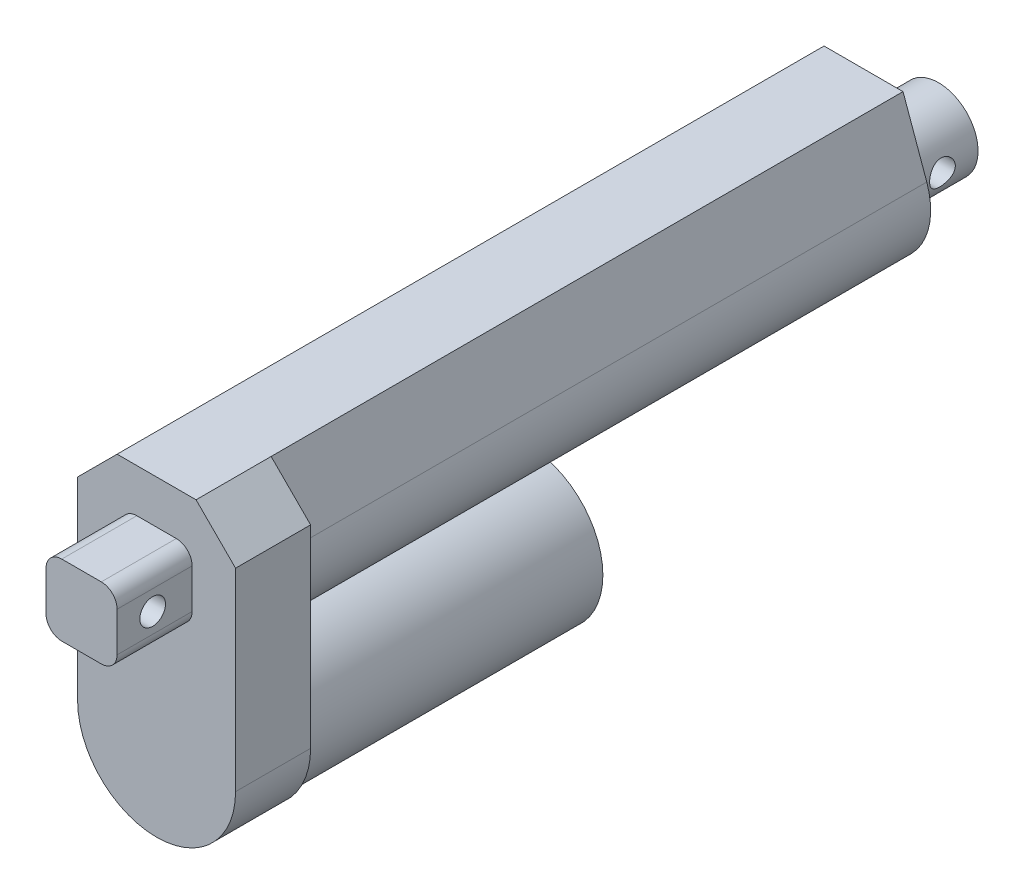
ISO-10303-21;
HEADER;
FILE_DESCRIPTION(('STEP AP214'),'2;1');
FILE_NAME('part.step','',(''),(''),'','','');
FILE_SCHEMA(('AUTOMOTIVE_DESIGN { 1 0 10303 214 1 1 1 1 }'));
ENDSEC;
DATA;
#1=APPLICATION_CONTEXT('core data for automotive mechanical design processes');
#2=APPLICATION_PROTOCOL_DEFINITION('international standard','automotive_design',2000,#1);
#3=PRODUCT_CONTEXT('',#1,'mechanical');
#4=PRODUCT('Part','Part','',(#3));
#5=PRODUCT_RELATED_PRODUCT_CATEGORY('part','',(#4));
#6=PRODUCT_DEFINITION_FORMATION('','',#4);
#7=PRODUCT_DEFINITION_CONTEXT('part definition',#1,'design');
#8=PRODUCT_DEFINITION('design','',#6,#7);
#9=PRODUCT_DEFINITION_SHAPE('','',#8);
#10=(LENGTH_UNIT() NAMED_UNIT(*) SI_UNIT(.MILLI.,.METRE.));
#11=(NAMED_UNIT(*) PLANE_ANGLE_UNIT() SI_UNIT($,.RADIAN.));
#12=(NAMED_UNIT(*) SI_UNIT($,.STERADIAN.) SOLID_ANGLE_UNIT());
#13=UNCERTAINTY_MEASURE_WITH_UNIT(LENGTH_MEASURE(1.E-05),#10,'distance_accuracy_value','');
#14=(GEOMETRIC_REPRESENTATION_CONTEXT(3) GLOBAL_UNCERTAINTY_ASSIGNED_CONTEXT((#13)) GLOBAL_UNIT_ASSIGNED_CONTEXT((#10,
#11,#12)) REPRESENTATION_CONTEXT('',''));
#15=CARTESIAN_POINT('',(0.,0.,0.));
#16=DIRECTION('',(0.,0.,1.));
#17=DIRECTION('',(1.,0.,0.));
#18=AXIS2_PLACEMENT_3D('',#15,#16,#17);
#19=CARTESIAN_POINT('',(0.,0.,0.));
#20=DIRECTION('',(0.,0.,1.));
#21=DIRECTION('',(1.,0.,0.));
#22=AXIS2_PLACEMENT_3D('',#19,#20,#21);
#23=PLANE('',#22);
#24=DIRECTION('',(0.,1.,0.));
#25=VECTOR('',#24,1.);
#26=CARTESIAN_POINT('',(-20.,0.,0.));
#27=LINE('',#26,#25);
#28=CARTESIAN_POINT('',(-20.,0.,0.));
#29=VERTEX_POINT('',#28);
#30=CARTESIAN_POINT('',(-20.,49.,0.));
#31=VERTEX_POINT('',#30);
#32=EDGE_CURVE('E185',#29,#31,#27,.T.);
#33=ORIENTED_EDGE('',*,*,#32,.F.);
#34=CARTESIAN_POINT('',(0.,0.,0.));
#35=DIRECTION('',(0.,0.,1.));
#36=DIRECTION('',(1.,0.,0.));
#37=AXIS2_PLACEMENT_3D('',#34,#35,#36);
#38=CIRCLE('',#37,20.);
#39=CARTESIAN_POINT('',(20.,0.,0.));
#40=VERTEX_POINT('',#39);
#41=EDGE_CURVE('E188',#29,#40,#38,.T.);
#42=ORIENTED_EDGE('',*,*,#41,.T.);
#43=DIRECTION('',(0.,-1.,0.));
#44=VECTOR('',#43,1.);
#45=CARTESIAN_POINT('',(20.,0.,0.));
#46=LINE('',#45,#44);
#47=CARTESIAN_POINT('',(20.,49.,0.));
#48=VERTEX_POINT('',#47);
#49=EDGE_CURVE('E210',#48,#40,#46,.T.);
#50=ORIENTED_EDGE('',*,*,#49,.F.);
#51=DIRECTION('',(0.707106781186548,-0.707106781186547,0.));
#52=VECTOR('',#51,1.);
#53=CARTESIAN_POINT('',(34.5,34.5,0.));
#54=LINE('',#53,#52);
#55=CARTESIAN_POINT('',(10.,59.,0.));
#56=VERTEX_POINT('',#55);
#57=EDGE_CURVE('E213',#56,#48,#54,.T.);
#58=ORIENTED_EDGE('',*,*,#57,.F.);
#59=DIRECTION('',(1.,0.,0.));
#60=VECTOR('',#59,1.);
#61=CARTESIAN_POINT('',(0.,59.,0.));
#62=LINE('',#61,#60);
#63=CARTESIAN_POINT('',(-10.,59.,0.));
#64=VERTEX_POINT('',#63);
#65=EDGE_CURVE('E215',#64,#56,#62,.T.);
#66=ORIENTED_EDGE('',*,*,#65,.F.);
#67=DIRECTION('',(0.707106781186548,0.707106781186547,0.));
#68=VECTOR('',#67,1.);
#69=CARTESIAN_POINT('',(-34.5,34.5,0.));
#70=LINE('',#69,#68);
#71=EDGE_CURVE('E198',#31,#64,#70,.T.);
#72=ORIENTED_EDGE('',*,*,#71,.F.);
#73=EDGE_LOOP('',(#33,#42,#50,#58,#66,#72));
#74=FACE_BOUND('',#73,.T.);
#75=DIRECTION('',(-1.,0.,0.));
#76=VECTOR('',#75,1.);
#77=CARTESIAN_POINT('',(-9.,48.,0.));
#78=LINE('',#77,#76);
#79=CARTESIAN_POINT('',(5.,48.,0.));
#80=VERTEX_POINT('',#79);
#81=CARTESIAN_POINT('',(-5.,48.,0.));
#82=VERTEX_POINT('',#81);
#83=EDGE_CURVE('E386',#80,#82,#78,.T.);
#84=ORIENTED_EDGE('',*,*,#83,.F.);
#85=CARTESIAN_POINT('',(5.,44.,0.));
#86=DIRECTION('',(0.,0.,1.));
#87=DIRECTION('',(1.,0.,0.));
#88=AXIS2_PLACEMENT_3D('',#85,#86,#87);
#89=CIRCLE('',#88,4.);
#90=CARTESIAN_POINT('',(9.00000000000001,44.,0.));
#91=VERTEX_POINT('',#90);
#92=EDGE_CURVE('E11',#80,#91,#89,.F.);
#93=ORIENTED_EDGE('',*,*,#92,.T.);
#94=DIRECTION('',(0.,1.,0.));
#95=VECTOR('',#94,1.);
#96=CARTESIAN_POINT('',(9.00000000000001,48.,0.));
#97=LINE('',#96,#95);
#98=CARTESIAN_POINT('',(9.00000000000001,34.,0.));
#99=VERTEX_POINT('',#98);
#100=EDGE_CURVE('E357',#99,#91,#97,.T.);
#101=ORIENTED_EDGE('',*,*,#100,.F.);
#102=CARTESIAN_POINT('',(5.,34.,0.));
#103=DIRECTION('',(0.,0.,1.));
#104=DIRECTION('',(1.,0.,0.));
#105=AXIS2_PLACEMENT_3D('',#102,#103,#104);
#106=CIRCLE('',#105,4.);
#107=CARTESIAN_POINT('',(5.,30.,0.));
#108=VERTEX_POINT('',#107);
#109=EDGE_CURVE('E351',#99,#108,#106,.F.);
#110=ORIENTED_EDGE('',*,*,#109,.T.);
#111=DIRECTION('',(1.,0.,0.));
#112=VECTOR('',#111,1.);
#113=CARTESIAN_POINT('',(-8.99999999999999,30.,0.));
#114=LINE('',#113,#112);
#115=CARTESIAN_POINT('',(-4.99999999999999,30.,0.));
#116=VERTEX_POINT('',#115);
#117=EDGE_CURVE('E355',#116,#108,#114,.T.);
#118=ORIENTED_EDGE('',*,*,#117,.F.);
#119=CARTESIAN_POINT('',(-4.99999999999999,34.,0.));
#120=DIRECTION('',(0.,0.,1.));
#121=DIRECTION('',(1.,0.,0.));
#122=AXIS2_PLACEMENT_3D('',#119,#120,#121);
#123=CIRCLE('',#122,4.);
#124=CARTESIAN_POINT('',(-8.99999999999999,34.,0.));
#125=VERTEX_POINT('',#124);
#126=EDGE_CURVE('E349',#116,#125,#123,.F.);
#127=ORIENTED_EDGE('',*,*,#126,.T.);
#128=DIRECTION('',(0.,-1.,0.));
#129=VECTOR('',#128,1.);
#130=CARTESIAN_POINT('',(-9.,48.,0.));
#131=LINE('',#130,#129);
#132=CARTESIAN_POINT('',(-9.,44.,0.));
#133=VERTEX_POINT('',#132);
#134=EDGE_CURVE('E369',#133,#125,#131,.T.);
#135=ORIENTED_EDGE('',*,*,#134,.F.);
#136=CARTESIAN_POINT('',(-5.,44.,0.));
#137=DIRECTION('',(0.,0.,1.));
#138=DIRECTION('',(1.,0.,0.));
#139=AXIS2_PLACEMENT_3D('',#136,#137,#138);
#140=CIRCLE('',#139,4.);
#141=EDGE_CURVE('E49',#133,#82,#140,.F.);
#142=ORIENTED_EDGE('',*,*,#141,.T.);
#143=EDGE_LOOP('',(#84,#93,#101,#110,#118,#127,#135,#142));
#144=FACE_BOUND('',#143,.T.);
#145=ADVANCED_FACE('F41',(#74,#144),#23,.T.);
#146=CARTESIAN_POINT('',(-20.,0.,-19.));
#147=DIRECTION('',(1.,0.,0.));
#148=DIRECTION('',(0.,0.,-1.));
#149=AXIS2_PLACEMENT_3D('',#146,#147,#148);
#150=PLANE('',#149);
#151=ORIENTED_EDGE('',*,*,#32,.T.);
#152=DIRECTION('',(0.,0.,1.));
#153=VECTOR('',#152,1.);
#154=CARTESIAN_POINT('',(-20.,49.,-19.));
#155=LINE('',#154,#153);
#156=CARTESIAN_POINT('',(-20.,49.,-19.));
#157=VERTEX_POINT('',#156);
#158=EDGE_CURVE('E218',#157,#31,#155,.T.);
#159=ORIENTED_EDGE('',*,*,#158,.F.);
#160=DIRECTION('',(0.,1.,0.));
#161=VECTOR('',#160,1.);
#162=CARTESIAN_POINT('',(-20.,0.,-19.));
#163=LINE('',#162,#161);
#164=CARTESIAN_POINT('',(-20.,0.,-19.));
#165=VERTEX_POINT('',#164);
#166=EDGE_CURVE('E194',#165,#157,#163,.T.);
#167=ORIENTED_EDGE('',*,*,#166,.F.);
#168=DIRECTION('',(0.,0.,1.));
#169=VECTOR('',#168,1.);
#170=CARTESIAN_POINT('',(-20.,0.,-19.));
#171=LINE('',#170,#169);
#172=EDGE_CURVE('E206',#165,#29,#171,.T.);
#173=ORIENTED_EDGE('',*,*,#172,.T.);
#174=EDGE_LOOP('',(#151,#159,#167,#173));
#175=FACE_BOUND('',#174,.T.);
#176=ADVANCED_FACE('F270',(#175),#150,.F.);
#177=CARTESIAN_POINT('',(-34.5,34.5,-19.));
#178=DIRECTION('',(0.707106781186547,-0.707106781186548,0.));
#179=DIRECTION('',(0.707106781186548,0.707106781186547,0.));
#180=AXIS2_PLACEMENT_3D('',#177,#178,#179);
#181=PLANE('',#180);
#182=ORIENTED_EDGE('',*,*,#71,.T.);
#183=DIRECTION('',(0.,0.,1.));
#184=VECTOR('',#183,1.);
#185=CARTESIAN_POINT('',(-10.,59.,-19.));
#186=LINE('',#185,#184);
#187=CARTESIAN_POINT('',(-10.,59.,-19.));
#188=VERTEX_POINT('',#187);
#189=EDGE_CURVE('E222',#188,#64,#186,.T.);
#190=ORIENTED_EDGE('',*,*,#189,.F.);
#191=DIRECTION('',(0.707106781186548,0.707106781186547,0.));
#192=VECTOR('',#191,1.);
#193=CARTESIAN_POINT('',(-34.5,34.5,-19.));
#194=LINE('',#193,#192);
#195=EDGE_CURVE('E205',#157,#188,#194,.T.);
#196=ORIENTED_EDGE('',*,*,#195,.F.);
#197=ORIENTED_EDGE('',*,*,#158,.T.);
#198=EDGE_LOOP('',(#182,#190,#196,#197));
#199=FACE_BOUND('',#198,.T.);
#200=ADVANCED_FACE('F278',(#199),#181,.F.);
#201=CARTESIAN_POINT('',(0.,59.,-19.));
#202=DIRECTION('',(0.,-1.,0.));
#203=DIRECTION('',(0.,0.,-1.));
#204=AXIS2_PLACEMENT_3D('',#201,#202,#203);
#205=PLANE('',#204);
#206=ORIENTED_EDGE('',*,*,#65,.T.);
#207=DIRECTION('',(0.,0.,1.));
#208=VECTOR('',#207,1.);
#209=CARTESIAN_POINT('',(10.,59.,-19.));
#210=LINE('',#209,#208);
#211=CARTESIAN_POINT('',(10.,59.,-19.));
#212=VERTEX_POINT('',#211);
#213=EDGE_CURVE('E225',#212,#56,#210,.T.);
#214=ORIENTED_EDGE('',*,*,#213,.F.);
#215=DIRECTION('',(0.,0.,1.));
#216=VECTOR('',#215,1.);
#217=CARTESIAN_POINT('',(9.99999999999999,59.,-179.));
#218=LINE('',#217,#216);
#219=CARTESIAN_POINT('',(9.99999999999999,59.,-179.));
#220=VERTEX_POINT('',#219);
#221=EDGE_CURVE('E399',#220,#212,#218,.T.);
#222=ORIENTED_EDGE('',*,*,#221,.F.);
#223=DIRECTION('',(1.,0.,0.));
#224=VECTOR('',#223,1.);
#225=CARTESIAN_POINT('',(0.,59.,-179.));
#226=LINE('',#225,#224);
#227=CARTESIAN_POINT('',(-10.,59.,-179.));
#228=VERTEX_POINT('',#227);
#229=EDGE_CURVE('E177',#228,#220,#226,.T.);
#230=ORIENTED_EDGE('',*,*,#229,.F.);
#231=DIRECTION('',(0.,0.,1.));
#232=VECTOR('',#231,1.);
#233=CARTESIAN_POINT('',(-10.,59.,-179.));
#234=LINE('',#233,#232);
#235=EDGE_CURVE('E190',#228,#188,#234,.T.);
#236=ORIENTED_EDGE('',*,*,#235,.T.);
#237=ORIENTED_EDGE('',*,*,#189,.T.);
#238=EDGE_LOOP('',(#206,#214,#222,#230,#236,#237));
#239=FACE_BOUND('',#238,.T.);
#240=ADVANCED_FACE('F288',(#239),#205,.F.);
#241=CARTESIAN_POINT('',(34.5,34.5,-19.));
#242=DIRECTION('',(-0.707106781186547,-0.707106781186548,0.));
#243=DIRECTION('',(0.707106781186548,-0.707106781186547,0.));
#244=AXIS2_PLACEMENT_3D('',#241,#242,#243);
#245=PLANE('',#244);
#246=ORIENTED_EDGE('',*,*,#57,.T.);
#247=DIRECTION('',(0.,0.,1.));
#248=VECTOR('',#247,1.);
#249=CARTESIAN_POINT('',(20.,49.,-19.));
#250=LINE('',#249,#248);
#251=CARTESIAN_POINT('',(20.,49.,-19.));
#252=VERTEX_POINT('',#251);
#253=EDGE_CURVE('E228',#252,#48,#250,.T.);
#254=ORIENTED_EDGE('',*,*,#253,.F.);
#255=DIRECTION('',(0.707106781186548,-0.707106781186547,0.));
#256=VECTOR('',#255,1.);
#257=CARTESIAN_POINT('',(34.5,34.5,-19.));
#258=LINE('',#257,#256);
#259=EDGE_CURVE('E203',#212,#252,#258,.T.);
#260=ORIENTED_EDGE('',*,*,#259,.F.);
#261=ORIENTED_EDGE('',*,*,#213,.T.);
#262=EDGE_LOOP('',(#246,#254,#260,#261));
#263=FACE_BOUND('',#262,.T.);
#264=ADVANCED_FACE('F292',(#263),#245,.F.);
#265=CARTESIAN_POINT('',(20.,0.,-19.));
#266=DIRECTION('',(-1.,0.,0.));
#267=DIRECTION('',(0.,0.,1.));
#268=AXIS2_PLACEMENT_3D('',#265,#266,#267);
#269=PLANE('',#268);
#270=ORIENTED_EDGE('',*,*,#49,.T.);
#271=DIRECTION('',(0.,0.,1.));
#272=VECTOR('',#271,1.);
#273=CARTESIAN_POINT('',(20.,0.,-19.));
#274=LINE('',#273,#272);
#275=CARTESIAN_POINT('',(20.,0.,-19.));
#276=VERTEX_POINT('',#275);
#277=EDGE_CURVE('E231',#276,#40,#274,.T.);
#278=ORIENTED_EDGE('',*,*,#277,.F.);
#279=DIRECTION('',(0.,-1.,0.));
#280=VECTOR('',#279,1.);
#281=CARTESIAN_POINT('',(20.,0.,-19.));
#282=LINE('',#281,#280);
#283=EDGE_CURVE('E201',#252,#276,#282,.T.);
#284=ORIENTED_EDGE('',*,*,#283,.F.);
#285=ORIENTED_EDGE('',*,*,#253,.T.);
#286=EDGE_LOOP('',(#270,#278,#284,#285));
#287=FACE_BOUND('',#286,.T.);
#288=ADVANCED_FACE('F296',(#287),#269,.F.);
#289=CARTESIAN_POINT('',(0.,0.,-19.));
#290=DIRECTION('',(0.,0.,1.));
#291=DIRECTION('',(1.,0.,0.));
#292=AXIS2_PLACEMENT_3D('',#289,#290,#291);
#293=CYLINDRICAL_SURFACE('',#292,20.);
#294=ORIENTED_EDGE('',*,*,#41,.F.);
#295=ORIENTED_EDGE('',*,*,#172,.F.);
#296=CARTESIAN_POINT('',(0.,0.,-19.));
#297=DIRECTION('',(0.,0.,1.));
#298=DIRECTION('',(1.,0.,0.));
#299=AXIS2_PLACEMENT_3D('',#296,#297,#298);
#300=CIRCLE('',#299,20.);
#301=EDGE_CURVE('E197',#165,#276,#300,.T.);
#302=ORIENTED_EDGE('',*,*,#301,.T.);
#303=ORIENTED_EDGE('',*,*,#277,.T.);
#304=EDGE_LOOP('',(#294,#295,#302,#303));
#305=FACE_BOUND('',#304,.T.);
#306=ADVANCED_FACE('F300',(#305),#293,.T.);
#307=CARTESIAN_POINT('',(0.,0.,-19.));
#308=DIRECTION('',(0.,0.,1.));
#309=DIRECTION('',(1.,0.,0.));
#310=AXIS2_PLACEMENT_3D('',#307,#308,#309);
#311=PLANE('',#310);
#312=CARTESIAN_POINT('',(0.,0.,-19.));
#313=DIRECTION('',(0.,0.,1.));
#314=DIRECTION('',(1.,0.,0.));
#315=AXIS2_PLACEMENT_3D('',#312,#313,#314);
#316=CIRCLE('',#315,19.);
#317=CARTESIAN_POINT('',(19.,0.,-19.));
#318=VERTEX_POINT('',#317);
#319=EDGE_CURVE('E372',#318,#318,#316,.F.);
#320=ORIENTED_EDGE('',*,*,#319,.F.);
#321=EDGE_LOOP('',(#320));
#322=FACE_BOUND('',#321,.T.);
#323=DIRECTION('',(0.336418561126064,-0.941712563221851,0.));
#324=VECTOR('',#323,1.);
#325=CARTESIAN_POINT('',(27.5599910625912,9.84556530307208,-19.));
#326=LINE('',#325,#324);
#327=CARTESIAN_POINT('',(16.0091135747715,42.1791155391431,-19.));
#328=VERTEX_POINT('',#327);
#329=EDGE_CURVE('E184',#212,#328,#326,.T.);
#330=ORIENTED_EDGE('',*,*,#329,.F.);
#331=ORIENTED_EDGE('',*,*,#259,.T.);
#332=ORIENTED_EDGE('',*,*,#283,.T.);
#333=ORIENTED_EDGE('',*,*,#301,.F.);
#334=ORIENTED_EDGE('',*,*,#166,.T.);
#335=ORIENTED_EDGE('',*,*,#195,.T.);
#336=DIRECTION('',(-0.336418561126065,-0.941712563221851,0.));
#337=VECTOR('',#336,1.);
#338=CARTESIAN_POINT('',(-27.5599910625912,9.8455653030721,-19.));
#339=LINE('',#338,#337);
#340=CARTESIAN_POINT('',(-16.0091135747715,42.1791155391431,-19.));
#341=VERTEX_POINT('',#340);
#342=EDGE_CURVE('E181',#188,#341,#339,.T.);
#343=ORIENTED_EDGE('',*,*,#342,.T.);
#344=CARTESIAN_POINT('',(0.,36.46,-19.));
#345=DIRECTION('',(0.,0.,-1.));
#346=DIRECTION('',(-1.,0.,0.));
#347=AXIS2_PLACEMENT_3D('',#344,#345,#346);
#348=CIRCLE('',#347,17.);
#349=EDGE_CURVE('E401',#328,#341,#348,.T.);
#350=ORIENTED_EDGE('',*,*,#349,.F.);
#351=EDGE_LOOP('',(#330,#331,#332,#333,#334,#335,#343,#350));
#352=FACE_BOUND('',#351,.T.);
#353=ADVANCED_FACE('F284',(#322,#352),#311,.F.);
#354=CARTESIAN_POINT('',(27.5599910625912,9.84556530307208,-179.));
#355=DIRECTION('',(-0.941712563221851,-0.336418561126064,0.));
#356=DIRECTION('',(0.336418561126064,-0.941712563221851,0.));
#357=AXIS2_PLACEMENT_3D('',#354,#355,#356);
#358=PLANE('',#357);
#359=ORIENTED_EDGE('',*,*,#329,.T.);
#360=DIRECTION('',(0.,0.,1.));
#361=VECTOR('',#360,1.);
#362=CARTESIAN_POINT('',(16.0091135747715,42.1791155391431,-179.));
#363=LINE('',#362,#361);
#364=CARTESIAN_POINT('',(16.0091135747715,42.1791155391431,-179.));
#365=VERTEX_POINT('',#364);
#366=EDGE_CURVE('E164',#365,#328,#363,.T.);
#367=ORIENTED_EDGE('',*,*,#366,.F.);
#368=DIRECTION('',(0.336418561126064,-0.941712563221851,0.));
#369=VECTOR('',#368,1.);
#370=CARTESIAN_POINT('',(27.5599910625912,9.84556530307208,-179.));
#371=LINE('',#370,#369);
#372=EDGE_CURVE('E172',#220,#365,#371,.T.);
#373=ORIENTED_EDGE('',*,*,#372,.F.);
#374=ORIENTED_EDGE('',*,*,#221,.T.);
#375=EDGE_LOOP('',(#359,#367,#373,#374));
#376=FACE_BOUND('',#375,.T.);
#377=ADVANCED_FACE('F183',(#376),#358,.F.);
#378=CARTESIAN_POINT('',(0.,36.46,-179.));
#379=DIRECTION('',(0.,0.,1.));
#380=DIRECTION('',(1.,0.,0.));
#381=AXIS2_PLACEMENT_3D('',#378,#379,#380);
#382=CYLINDRICAL_SURFACE('',#381,17.);
#383=ORIENTED_EDGE('',*,*,#349,.T.);
#384=DIRECTION('',(0.,0.,1.));
#385=VECTOR('',#384,1.);
#386=CARTESIAN_POINT('',(-16.0091135747715,42.1791155391431,-179.));
#387=LINE('',#386,#385);
#388=CARTESIAN_POINT('',(-16.0091135747715,42.1791155391431,-179.));
#389=VERTEX_POINT('',#388);
#390=EDGE_CURVE('E167',#389,#341,#387,.T.);
#391=ORIENTED_EDGE('',*,*,#390,.F.);
#392=CARTESIAN_POINT('',(0.,36.46,-179.));
#393=DIRECTION('',(0.,0.,-1.));
#394=DIRECTION('',(-1.,0.,0.));
#395=AXIS2_PLACEMENT_3D('',#392,#393,#394);
#396=CIRCLE('',#395,17.);
#397=EDGE_CURVE('E159',#365,#389,#396,.T.);
#398=ORIENTED_EDGE('',*,*,#397,.F.);
#399=ORIENTED_EDGE('',*,*,#366,.T.);
#400=EDGE_LOOP('',(#383,#391,#398,#399));
#401=FACE_BOUND('',#400,.T.);
#402=ADVANCED_FACE('F162',(#401),#382,.T.);
#403=CARTESIAN_POINT('',(-27.5599910625912,9.8455653030721,-179.));
#404=DIRECTION('',(-0.941712563221851,0.336418561126065,0.));
#405=DIRECTION('',(-0.336418561126065,-0.941712563221851,0.));
#406=AXIS2_PLACEMENT_3D('',#403,#404,#405);
#407=PLANE('',#406);
#408=ORIENTED_EDGE('',*,*,#342,.F.);
#409=ORIENTED_EDGE('',*,*,#235,.F.);
#410=DIRECTION('',(-0.336418561126065,-0.941712563221851,0.));
#411=VECTOR('',#410,1.);
#412=CARTESIAN_POINT('',(-27.5599910625912,9.8455653030721,-179.));
#413=LINE('',#412,#411);
#414=EDGE_CURVE('E171',#228,#389,#413,.T.);
#415=ORIENTED_EDGE('',*,*,#414,.T.);
#416=ORIENTED_EDGE('',*,*,#390,.T.);
#417=EDGE_LOOP('',(#408,#409,#415,#416));
#418=FACE_BOUND('',#417,.T.);
#419=ADVANCED_FACE('F409',(#418),#407,.T.);
#420=CARTESIAN_POINT('',(0.,0.,-179.));
#421=DIRECTION('',(0.,0.,-1.));
#422=DIRECTION('',(-1.,0.,0.));
#423=AXIS2_PLACEMENT_3D('',#420,#421,#422);
#424=PLANE('',#423);
#425=CARTESIAN_POINT('',(0.,36.46,-179.));
#426=DIRECTION('',(0.,0.,-1.));
#427=DIRECTION('',(-1.,0.,0.));
#428=AXIS2_PLACEMENT_3D('',#425,#426,#427);
#429=CIRCLE('',#428,10.);
#430=CARTESIAN_POINT('',(-10.,36.46,-179.));
#431=VERTEX_POINT('',#430);
#432=EDGE_CURVE('E221',#431,#431,#429,.T.);
#433=ORIENTED_EDGE('',*,*,#432,.F.);
#434=EDGE_LOOP('',(#433));
#435=FACE_BOUND('',#434,.T.);
#436=ORIENTED_EDGE('',*,*,#372,.T.);
#437=ORIENTED_EDGE('',*,*,#397,.T.);
#438=ORIENTED_EDGE('',*,*,#414,.F.);
#439=ORIENTED_EDGE('',*,*,#229,.T.);
#440=EDGE_LOOP('',(#436,#437,#438,#439));
#441=FACE_BOUND('',#440,.T.);
#442=ADVANCED_FACE('F175',(#435,#441),#424,.T.);
#443=CARTESIAN_POINT('',(0.,36.46,-198.));
#444=DIRECTION('',(0.,0.,1.));
#445=DIRECTION('',(1.,0.,0.));
#446=AXIS2_PLACEMENT_3D('',#443,#444,#445);
#447=CYLINDRICAL_SURFACE('',#446,10.);
#448=CARTESIAN_POINT('',(10.,36.46,-192.21728146111));
#449=CARTESIAN_POINT('',(9.99999986147675,36.2852267054536,-192.242270545886));
#450=CARTESIAN_POINT('',(9.99537581916662,36.1084109669922,-192.252971967629));
#451=CARTESIAN_POINT('',(9.97674188954075,35.7558834728552,-192.245611262686));
#452=CARTESIAN_POINT('',(9.96273174762877,35.5801717472563,-192.227548355754));
#453=CARTESIAN_POINT('',(9.92621231513767,35.2350945253202,-192.163570953362));
#454=CARTESIAN_POINT('',(9.90371456679146,35.0657207523412,-192.117694230503));
#455=CARTESIAN_POINT('',(9.85192595807166,34.7374431165955,-191.999814332676));
#456=CARTESIAN_POINT('',(9.82263380146499,34.5785412590919,-191.927806170887));
#457=CARTESIAN_POINT('',(9.75871385456787,34.2707286685426,-191.757519086339));
#458=CARTESIAN_POINT('',(9.72396078388169,34.1222164055505,-191.65856796115));
#459=CARTESIAN_POINT('',(9.65271466729046,33.8435481861153,-191.43799408411));
#460=CARTESIAN_POINT('',(9.61622108685189,33.7133979180921,-191.31636433355));
#461=CARTESIAN_POINT('',(9.54314731276294,33.4691256995524,-191.047347785952));
#462=CARTESIAN_POINT('',(9.50663613349773,33.3559799927062,-190.899052823597));
#463=CARTESIAN_POINT('',(9.43908761594782,33.1562472583259,-190.584386605831));
#464=CARTESIAN_POINT('',(9.40804975812996,33.0696577094774,-190.4180170685));
#465=CARTESIAN_POINT('',(9.35549219422971,32.9272292812594,-190.074500679166));
#466=CARTESIAN_POINT('',(9.33382054895043,32.8708956200305,-189.897583378256));
#467=CARTESIAN_POINT('',(9.30196637665703,32.789115013157,-189.535781501334));
#468=CARTESIAN_POINT('',(9.29177728658934,32.7636504231288,-189.350901539324));
#469=CARTESIAN_POINT('',(9.28447717009103,32.7453595188411,-188.991432998118));
#470=CARTESIAN_POINT('',(9.28655529822521,32.7505097721879,-188.816961084536));
#471=CARTESIAN_POINT('',(9.30165739473878,32.7885452421265,-188.471568682629));
#472=CARTESIAN_POINT('',(9.31468098017105,32.8214294883932,-188.300648070269));
#473=CARTESIAN_POINT('',(9.34985530947712,32.9128146605513,-187.970100056181));
#474=CARTESIAN_POINT('',(9.3718424879765,32.9708576381873,-187.810327449976));
#475=CARTESIAN_POINT('',(9.42266507895349,33.1105397766892,-187.502640088642));
#476=CARTESIAN_POINT('',(9.45150221343077,33.192184871976,-187.35472832772));
#477=CARTESIAN_POINT('',(9.51506006509683,33.3819864578544,-187.066099965429));
#478=CARTESIAN_POINT('',(9.55001846673214,33.4913626562013,-186.926238047068));
#479=CARTESIAN_POINT('',(9.6212876669345,33.7311799179576,-186.666279615373));
#480=CARTESIAN_POINT('',(9.65759890868237,33.8616279318656,-186.546189650264));
#481=CARTESIAN_POINT('',(9.73015918475437,34.1476811945044,-186.323073146627));
#482=CARTESIAN_POINT('',(9.76631284851531,34.3042230056405,-186.22121164426));
#483=CARTESIAN_POINT('',(9.83318459123291,34.6333530940511,-186.045415887539));
#484=CARTESIAN_POINT('',(9.86390333942992,34.8059393916543,-185.971478193451));
#485=CARTESIAN_POINT('',(9.91662306059768,35.1592701754631,-185.855221274379));
#486=CARTESIAN_POINT('',(9.93876966922555,35.3398144029994,-185.812361936367));
#487=CARTESIAN_POINT('',(9.97326569409392,35.7064599692357,-185.757987416117));
#488=CARTESIAN_POINT('',(9.98561868606352,35.8925592539643,-185.746460790314));
#489=CARTESIAN_POINT('',(9.99946054287141,36.25498215668,-185.755207293305));
#490=CARTESIAN_POINT('',(10.0014655450478,36.4313257800166,-185.773907108905));
#491=CARTESIAN_POINT('',(9.99643448890837,36.7784918090561,-185.839674379785));
#492=CARTESIAN_POINT('',(9.98939889602409,36.9493144985258,-185.886740374641));
#493=CARTESIAN_POINT('',(9.96778069723989,37.2787318916153,-186.007048612801));
#494=CARTESIAN_POINT('',(9.95328414423357,37.4374428214727,-186.079989502606));
#495=CARTESIAN_POINT('',(9.91882387504543,37.7407252161477,-186.249979815845));
#496=CARTESIAN_POINT('',(9.89885913821932,37.8852940344766,-186.347033739696));
#497=CARTESIAN_POINT('',(9.85518782347838,38.1616299355661,-186.566470074677));
#498=CARTESIAN_POINT('',(9.83137438212085,38.2927683740172,-186.689622906312));
#499=CARTESIAN_POINT('',(9.78354525343222,38.5329873411773,-186.95582984035));
#500=CARTESIAN_POINT('',(9.75952952549449,38.6420633256193,-187.098888032498));
#501=CARTESIAN_POINT('',(9.71369009224631,38.8379505692972,-187.405476015843));
#502=CARTESIAN_POINT('',(9.6919434825731,38.924077909,-187.569455722103));
#503=CARTESIAN_POINT('',(9.65437197996711,39.0674187203522,-187.910233156751));
#504=CARTESIAN_POINT('',(9.63854588378926,39.1246380678957,-188.087028271894));
#505=CARTESIAN_POINT('',(9.61531204872331,39.2072890110996,-188.444395622773));
#506=CARTESIAN_POINT('',(9.60772932385331,39.2333825472179,-188.624802999209));
#507=CARTESIAN_POINT('',(9.60144983048559,39.2550495670259,-188.987577723294));
#508=CARTESIAN_POINT('',(9.60275125876676,39.250629244127,-189.169944665708));
#509=CARTESIAN_POINT('',(9.61386829610819,39.2120718154064,-189.525415983323));
#510=CARTESIAN_POINT('',(9.62341584811503,39.1788701810714,-189.698631541397));
#511=CARTESIAN_POINT('',(9.64940475414426,39.0851345059067,-190.036950575229));
#512=CARTESIAN_POINT('',(9.66584685818219,39.0245974913754,-190.202053166243));
#513=CARTESIAN_POINT('',(9.70382102463619,38.8769651602688,-190.522201751278));
#514=CARTESIAN_POINT('',(9.72542324699401,38.7894984842895,-190.677067814826));
#515=CARTESIAN_POINT('',(9.77089676135937,38.5907152014836,-190.970301196093));
#516=CARTESIAN_POINT('',(9.79476860213262,38.479392818441,-191.108664505326));
#517=CARTESIAN_POINT('',(9.84270441022178,38.2313420283858,-191.370064758809));
#518=CARTESIAN_POINT('',(9.86674535903698,38.0938548711629,-191.492387360298));
#519=CARTESIAN_POINT('',(9.9109504297121,37.7998211881628,-191.712349592498));
#520=CARTESIAN_POINT('',(9.93111501214238,37.6432769302688,-191.809992156));
#521=CARTESIAN_POINT('',(9.96420837966139,37.3202820064214,-191.975105030009));
#522=CARTESIAN_POINT('',(9.97733681713109,37.1542717527738,-192.043395561223));
#523=CARTESIAN_POINT('',(9.995231481316,36.8128746529338,-192.151790879084));
#524=CARTESIAN_POINT('',(10.0000001406769,36.6374905497894,-192.191903863192));
#525=CARTESIAN_POINT('',(10.,36.46,-192.21728146111));
#526=B_SPLINE_CURVE_WITH_KNOTS('',3,(#448,#449,#450,#451,#452,#453,#454,#455,#456,#457,#458,
#459,#460,#461,#462,#463,#464,#465,#466,#467,#468,#469,#470,#471,#472,#473,#474,#475,#476,#477,
#478,#479,#480,#481,#482,#483,#484,#485,#486,#487,#488,#489,#490,#491,#492,#493,#494,#495,#496,
#497,#498,#499,#500,#501,#502,#503,#504,#505,#506,#507,#508,#509,#510,#511,#512,#513,#514,#515,
#516,#517,#518,#519,#520,#521,#522,#523,#524,#525),.UNSPECIFIED.,.T.,.F.,(4,2,2,2,2,2,2,2,2,2,2,
2,2,2,2,2,2,2,2,2,2,2,2,2,2,2,2,2,2,2,2,2,2,2,2,2,2,2,4),(0.,0.529003817396461,1.0580219845055,
1.58632332186683,2.11472553125504,2.65775863617746,3.20095960134824,3.76843626779111,
4.33585903975306,4.893695907364,5.45121377167167,5.97231171509908,6.49339142770659,
7.00536031328113,7.51745803837058,8.05797168815434,8.5986639907775,9.16660703223521,
9.73448009002307,10.2922306913022,10.8497775593989,11.3792261574209,11.9086474992502,
12.4320950865786,12.9556404428034,13.4975894504826,14.0396499715375,14.5964087773954,
15.1530543698135,15.6976380325743,16.2421111641984,16.7695240315597,17.2969942877845,
17.8320914266409,18.3673182760157,18.9214580153794,19.4755318738969,20.0129166813671,
20.5501450870802),.UNSPECIFIED.);
#527=CARTESIAN_POINT('',(10.,36.46,-192.21728146111));
#528=VERTEX_POINT('',#527);
#529=EDGE_CURVE('E242',#528,#528,#526,.T.);
#530=ORIENTED_EDGE('',*,*,#529,.T.);
#531=EDGE_LOOP('',(#530));
#532=FACE_BOUND('',#531,.T.);
#533=CARTESIAN_POINT('',(-9.98941439725072,36.,-192.25));
#534=CARTESIAN_POINT('',(-9.99752770381845,36.1761669723425,-192.250001317785));
#535=CARTESIAN_POINT('',(-10.0009363168689,36.3525433409372,-192.235631292716));
#536=CARTESIAN_POINT('',(-9.99862072309066,36.7005664199169,-192.178490613795));
#537=CARTESIAN_POINT('',(-9.9928963990352,36.8722130695642,-192.135719595403));
#538=CARTESIAN_POINT('',(-9.97355713695405,37.205687255532,-192.023203221015));
#539=CARTESIAN_POINT('',(-9.95995168161061,37.3675263344038,-191.953490315349));
#540=CARTESIAN_POINT('',(-9.92684671982662,37.6773852777264,-191.789201847737));
#541=CARTESIAN_POINT('',(-9.90734610157209,37.8254025285142,-191.694621596308));
#542=CARTESIAN_POINT('',(-9.86444430057212,38.1072900281999,-191.480699290711));
#543=CARTESIAN_POINT('',(-9.84096203004062,38.2407447086663,-191.360826246921));
#544=CARTESIAN_POINT('',(-9.79338689888956,38.4861361865787,-191.100854714999));
#545=CARTESIAN_POINT('',(-9.76929392546997,38.5980689755525,-190.960752467649));
#546=CARTESIAN_POINT('',(-9.72280798577348,38.8005440124676,-190.659331176098));
#547=CARTESIAN_POINT('',(-9.7004872008513,38.8903482975799,-190.497503772728));
#548=CARTESIAN_POINT('',(-9.66139421284723,39.0413927325171,-190.160399227207));
#549=CARTESIAN_POINT('',(-9.6446210710431,39.1026377156097,-189.985124366704));
#550=CARTESIAN_POINT('',(-9.61922416284485,39.1936311309152,-189.629499673936));
#551=CARTESIAN_POINT('',(-9.61045403264902,39.2239464946486,-189.449305781852));
#552=CARTESIAN_POINT('',(-9.60177389507897,39.2539576107975,-189.086192497681));
#553=CARTESIAN_POINT('',(-9.60186189395102,39.2536602534066,-188.903273728166));
#554=CARTESIAN_POINT('',(-9.61072695252456,39.222996279618,-188.546312535024));
#555=CARTESIAN_POINT('',(-9.61921719004416,39.1936222287922,-188.372176385871));
#556=CARTESIAN_POINT('',(-9.64333235519425,39.1072870891557,-188.031408327107));
#557=CARTESIAN_POINT('',(-9.65895796472762,39.0503233636634,-187.864777136392));
#558=CARTESIAN_POINT('',(-9.69555727777299,38.9097897011353,-187.541565942324));
#559=CARTESIAN_POINT('',(-9.71658859997469,38.8259305411501,-187.38511853316));
#560=CARTESIAN_POINT('',(-9.76129267448219,38.6341290457191,-187.088162125292));
#561=CARTESIAN_POINT('',(-9.78496602330977,38.5261812659779,-186.947656740507));
#562=CARTESIAN_POINT('',(-9.83292858299823,38.2846062994854,-186.681260675));
#563=CARTESIAN_POINT('',(-9.85720923920689,38.1501938146123,-186.556079240802));
#564=CARTESIAN_POINT('',(-9.90232664207335,37.8618511010071,-186.329871913607));
#565=CARTESIAN_POINT('',(-9.92316338225789,37.7079208355899,-186.228846066013));
#566=CARTESIAN_POINT('',(-9.95847088156094,37.3847777384989,-186.054055405497));
#567=CARTESIAN_POINT('',(-9.97294786989033,37.2155800575961,-185.980263928601));
#568=CARTESIAN_POINT('',(-9.9932523223279,36.8666806394606,-185.862286079387));
#569=CARTESIAN_POINT('',(-9.99908247534563,36.6869821857322,-185.818090505965));
#570=CARTESIAN_POINT('',(-10.0006847010623,36.3297784484854,-185.761921261206));
#571=CARTESIAN_POINT('',(-9.99684055576272,36.1524614263999,-185.748757005017));
#572=CARTESIAN_POINT('',(-9.9796709778859,35.7985251849041,-185.751427790782));
#573=CARTESIAN_POINT('',(-9.96634638302029,35.6219059052265,-185.767260270721));
#574=CARTESIAN_POINT('',(-9.93128907752138,35.2771760859584,-185.826649916252));
#575=CARTESIAN_POINT('',(-9.90969128114928,35.1089756210979,-185.86976910891));
#576=CARTESIAN_POINT('',(-9.85967377938466,34.7824595181522,-185.981738861834));
#577=CARTESIAN_POINT('',(-9.83125288103384,34.62414561475,-186.050593922959));
#578=CARTESIAN_POINT('',(-9.76867173682391,34.3155292832534,-186.214909602789));
#579=CARTESIAN_POINT('',(-9.73433974389767,34.1657308535379,-186.311250326158));
#580=CARTESIAN_POINT('',(-9.6636321999879,33.8840859374595,-186.526768210399));
#581=CARTESIAN_POINT('',(-9.62725595024493,33.7522456428455,-186.64595321378));
#582=CARTESIAN_POINT('',(-9.55402681572843,33.5039723436165,-186.910332414659));
#583=CARTESIAN_POINT('',(-9.51722861025323,33.3885235174846,-187.056468907411));
#584=CARTESIAN_POINT('',(-9.44871766112317,33.1838090348497,-187.367160575001));
#585=CARTESIAN_POINT('',(-9.41700460069397,33.0945417471048,-187.531714601452));
#586=CARTESIAN_POINT('',(-9.36264853174353,32.9461684447215,-187.872737022323));
#587=CARTESIAN_POINT('',(-9.33989233189946,32.8866832581631,-188.049021461807));
#588=CARTESIAN_POINT('',(-9.30571248949819,32.7985796502685,-188.410168518998));
#589=CARTESIAN_POINT('',(-9.29428229494186,32.7699433822546,-188.595026112335));
#590=CARTESIAN_POINT('',(-9.28458994325021,32.7456316226845,-188.955110411506));
#591=CARTESIAN_POINT('',(-9.28551940078153,32.7479327780887,-189.130181169588));
#592=CARTESIAN_POINT('',(-9.29847718680833,32.7805132017337,-189.477263119709));
#593=CARTESIAN_POINT('',(-9.31050484368717,32.8107907769587,-189.649274496248));
#594=CARTESIAN_POINT('',(-9.34388373439737,32.8971506089798,-189.981679669779));
#595=CARTESIAN_POINT('',(-9.36502819031827,32.9526619725275,-190.14224405793));
#596=CARTESIAN_POINT('',(-9.41439972327685,33.0874334320541,-190.451891100841));
#597=CARTESIAN_POINT('',(-9.44262850269804,33.1666992371843,-190.600970984572));
#598=CARTESIAN_POINT('',(-9.50514552333773,33.3515914449658,-190.89201382718));
#599=CARTESIAN_POINT('',(-9.53967634232491,33.4583965274619,-191.033175416566));
#600=CARTESIAN_POINT('',(-9.61040610012751,33.6932118044574,-191.296154583055));
#601=CARTESIAN_POINT('',(-9.64660562052118,33.8212294329369,-191.417965349206));
#602=CARTESIAN_POINT('',(-9.71936071158748,34.1028321948549,-191.645315367758));
#603=CARTESIAN_POINT('',(-9.7558340526311,34.2574107840856,-191.749654965862));
#604=CARTESIAN_POINT('',(-9.82366810991667,34.5829942500643,-191.930746398335));
#605=CARTESIAN_POINT('',(-9.85502969976945,34.7539963120447,-192.007502949421));
#606=CARTESIAN_POINT('',(-9.90879327416598,35.1014737818123,-192.12854112767));
#607=CARTESIAN_POINT('',(-9.93147588128492,35.277533914542,-192.173887235891));
#608=CARTESIAN_POINT('',(-9.96758725533116,35.6356560993592,-192.234610565811));
#609=CARTESIAN_POINT('',(-9.98101937107456,35.8177159544205,-192.249998636457));
#610=CARTESIAN_POINT('',(-9.98941439725072,36.,-192.25));
#611=B_SPLINE_CURVE_WITH_KNOTS('',3,(#533,#534,#535,#536,#537,#538,#539,#540,#541,#542,#543,
#544,#545,#546,#547,#548,#549,#550,#551,#552,#553,#554,#555,#556,#557,#558,#559,#560,#561,#562,
#563,#564,#565,#566,#567,#568,#569,#570,#571,#572,#573,#574,#575,#576,#577,#578,#579,#580,#581,
#582,#583,#584,#585,#586,#587,#588,#589,#590,#591,#592,#593,#594,#595,#596,#597,#598,#599,#600,
#601,#602,#603,#604,#605,#606,#607,#608,#609,#610),.UNSPECIFIED.,.T.,.F.,(4,2,2,2,2,2,2,2,2,2,2,
2,2,2,2,2,2,2,2,2,2,2,2,2,2,2,2,2,2,2,2,2,2,2,2,2,2,2,4),(0.,0.528403280838219,1.05681334410636,
1.58458893408705,2.11246412347757,2.65277866639441,3.1931937461205,3.74973483615507,
4.30618170507995,4.85223515768657,5.39816570695049,5.9260813427459,6.45404744017925,
6.98789297385477,7.52185928496737,8.07507044832803,8.62828265150251,9.18095178301818,
9.73344901475024,10.2643767310773,10.7952575393839,11.3178262278023,11.8404863493043,
12.3822413443355,12.9241826596849,13.4909837416098,14.0577495014652,14.6171032914133,
15.176133310641,15.6987902243005,16.2214155110228,16.7327639308007,17.2442353469471,
17.7829352285037,18.3218242993783,18.8891839023281,19.4564464402284,20.0033956585605,
20.5501467688729),.UNSPECIFIED.);
#612=CARTESIAN_POINT('',(-9.98941439725072,36.,-192.25));
#613=VERTEX_POINT('',#612);
#614=EDGE_CURVE('E234',#613,#613,#611,.T.);
#615=ORIENTED_EDGE('',*,*,#614,.T.);
#616=EDGE_LOOP('',(#615));
#617=FACE_BOUND('',#616,.T.);
#618=CARTESIAN_POINT('',(0.,36.46,-198.));
#619=DIRECTION('',(0.,0.,-1.));
#620=DIRECTION('',(-1.,0.,0.));
#621=AXIS2_PLACEMENT_3D('',#618,#619,#620);
#622=CIRCLE('',#621,10.);
#623=CARTESIAN_POINT('',(-10.,36.46,-198.));
#624=VERTEX_POINT('',#623);
#625=EDGE_CURVE('E393',#624,#624,#622,.T.);
#626=ORIENTED_EDGE('',*,*,#625,.F.);
#627=EDGE_LOOP('',(#626));
#628=FACE_BOUND('',#627,.T.);
#629=ORIENTED_EDGE('',*,*,#432,.T.);
#630=EDGE_LOOP('',(#629));
#631=FACE_BOUND('',#630,.T.);
#632=ADVANCED_FACE('F248',(#532,#617,#628,#631),#447,.T.);
#633=CARTESIAN_POINT('',(0.,36.46,-198.));
#634=DIRECTION('',(0.,0.,-1.));
#635=DIRECTION('',(-1.,0.,0.));
#636=AXIS2_PLACEMENT_3D('',#633,#634,#635);
#637=PLANE('',#636);
#638=ORIENTED_EDGE('',*,*,#625,.T.);
#639=EDGE_LOOP('',(#638));
#640=FACE_BOUND('',#639,.T.);
#641=ADVANCED_FACE('F257',(#640),#637,.T.);
#642=CARTESIAN_POINT('',(-20.,36.,-189.));
#643=DIRECTION('',(1.,0.,0.));
#644=DIRECTION('',(0.,0.,-1.));
#645=AXIS2_PLACEMENT_3D('',#642,#643,#644);
#646=CYLINDRICAL_SURFACE('',#645,3.25000000000001);
#647=ORIENTED_EDGE('',*,*,#614,.F.);
#648=EDGE_LOOP('',(#647));
#649=FACE_BOUND('',#648,.T.);
#650=ORIENTED_EDGE('',*,*,#529,.F.);
#651=EDGE_LOOP('',(#650));
#652=FACE_BOUND('',#651,.T.);
#653=ADVANCED_FACE('F252',(#649,#652),#646,.F.);
#654=CARTESIAN_POINT('',(0.,0.,-94.));
#655=DIRECTION('',(0.,0.,1.));
#656=DIRECTION('',(1.,0.,0.));
#657=AXIS2_PLACEMENT_3D('',#654,#655,#656);
#658=CYLINDRICAL_SURFACE('',#657,19.);
#659=CARTESIAN_POINT('',(0.,0.,-94.));
#660=DIRECTION('',(0.,0.,-1.));
#661=DIRECTION('',(-1.,0.,0.));
#662=AXIS2_PLACEMENT_3D('',#659,#660,#661);
#663=CIRCLE('',#662,19.);
#664=CARTESIAN_POINT('',(-19.,0.,-94.));
#665=VERTEX_POINT('',#664);
#666=EDGE_CURVE('E243',#665,#665,#663,.T.);
#667=ORIENTED_EDGE('',*,*,#666,.F.);
#668=EDGE_LOOP('',(#667));
#669=FACE_BOUND('',#668,.T.);
#670=ORIENTED_EDGE('',*,*,#319,.T.);
#671=EDGE_LOOP('',(#670));
#672=FACE_BOUND('',#671,.T.);
#673=ADVANCED_FACE('F256',(#669,#672),#658,.T.);
#674=CARTESIAN_POINT('',(0.,0.,-94.));
#675=DIRECTION('',(0.,0.,-1.));
#676=DIRECTION('',(-1.,0.,0.));
#677=AXIS2_PLACEMENT_3D('',#674,#675,#676);
#678=PLANE('',#677);
#679=ORIENTED_EDGE('',*,*,#666,.T.);
#680=EDGE_LOOP('',(#679));
#681=FACE_BOUND('',#680,.T.);
#682=ADVANCED_FACE('F430',(#681),#678,.T.);
#683=CARTESIAN_POINT('',(9.00000000000001,48.,19.));
#684=DIRECTION('',(-1.,0.,0.));
#685=DIRECTION('',(0.,0.,1.));
#686=AXIS2_PLACEMENT_3D('',#683,#684,#685);
#687=PLANE('',#686);
#688=CARTESIAN_POINT('',(9.00000000000001,39.,10.));
#689=DIRECTION('',(-1.,0.,0.));
#690=DIRECTION('',(0.,0.,1.));
#691=AXIS2_PLACEMENT_3D('',#688,#689,#690);
#692=CIRCLE('',#691,3.25);
#693=CARTESIAN_POINT('',(9.00000000000001,39.,13.25));
#694=VERTEX_POINT('',#693);
#695=EDGE_CURVE('E463',#694,#694,#692,.T.);
#696=ORIENTED_EDGE('',*,*,#695,.T.);
#697=EDGE_LOOP('',(#696));
#698=FACE_BOUND('',#697,.T.);
#699=DIRECTION('',(0.,1.,0.));
#700=VECTOR('',#699,1.);
#701=CARTESIAN_POINT('',(9.00000000000001,48.,19.));
#702=LINE('',#701,#700);
#703=CARTESIAN_POINT('',(9.00000000000001,34.,19.));
#704=VERTEX_POINT('',#703);
#705=CARTESIAN_POINT('',(9.00000000000001,44.,19.));
#706=VERTEX_POINT('',#705);
#707=EDGE_CURVE('E368',#704,#706,#702,.T.);
#708=ORIENTED_EDGE('',*,*,#707,.F.);
#709=DIRECTION('',(0.,0.,-1.));
#710=VECTOR('',#709,1.);
#711=CARTESIAN_POINT('',(9.00000000000001,34.,19.));
#712=LINE('',#711,#710);
#713=EDGE_CURVE('E343',#704,#99,#712,.T.);
#714=ORIENTED_EDGE('',*,*,#713,.T.);
#715=ORIENTED_EDGE('',*,*,#100,.T.);
#716=DIRECTION('',(0.,0.,-1.));
#717=VECTOR('',#716,1.);
#718=CARTESIAN_POINT('',(9.00000000000001,44.,19.));
#719=LINE('',#718,#717);
#720=EDGE_CURVE('E341',#91,#706,#719,.F.);
#721=ORIENTED_EDGE('',*,*,#720,.T.);
#722=EDGE_LOOP('',(#708,#714,#715,#721));
#723=FACE_BOUND('',#722,.T.);
#724=ADVANCED_FACE('F434',(#698,#723),#687,.F.);
#725=CARTESIAN_POINT('',(-9.,48.,19.));
#726=DIRECTION('',(0.,-1.,0.));
#727=DIRECTION('',(0.,0.,-1.));
#728=AXIS2_PLACEMENT_3D('',#725,#726,#727);
#729=PLANE('',#728);
#730=ORIENTED_EDGE('',*,*,#83,.T.);
#731=DIRECTION('',(0.,0.,-1.));
#732=VECTOR('',#731,1.);
#733=CARTESIAN_POINT('',(-5.,48.,19.));
#734=LINE('',#733,#732);
#735=CARTESIAN_POINT('',(-5.,48.,19.));
#736=VERTEX_POINT('',#735);
#737=EDGE_CURVE('E324',#82,#736,#734,.F.);
#738=ORIENTED_EDGE('',*,*,#737,.T.);
#739=DIRECTION('',(-1.,0.,0.));
#740=VECTOR('',#739,1.);
#741=CARTESIAN_POINT('',(-9.,48.,19.));
#742=LINE('',#741,#740);
#743=CARTESIAN_POINT('',(5.,48.,19.));
#744=VERTEX_POINT('',#743);
#745=EDGE_CURVE('E384',#744,#736,#742,.T.);
#746=ORIENTED_EDGE('',*,*,#745,.F.);
#747=DIRECTION('',(0.,0.,-1.));
#748=VECTOR('',#747,1.);
#749=CARTESIAN_POINT('',(5.,48.,19.));
#750=LINE('',#749,#748);
#751=EDGE_CURVE('E346',#744,#80,#750,.T.);
#752=ORIENTED_EDGE('',*,*,#751,.T.);
#753=EDGE_LOOP('',(#730,#738,#746,#752));
#754=FACE_BOUND('',#753,.T.);
#755=ADVANCED_FACE('F440',(#754),#729,.F.);
#756=CARTESIAN_POINT('',(-9.,48.,19.));
#757=DIRECTION('',(1.,0.,0.));
#758=DIRECTION('',(0.,1.,0.));
#759=AXIS2_PLACEMENT_3D('',#756,#757,#758);
#760=PLANE('',#759);
#761=CARTESIAN_POINT('',(-8.99999999999999,39.,10.));
#762=DIRECTION('',(-1.,0.,0.));
#763=DIRECTION('',(0.,-1.,0.));
#764=AXIS2_PLACEMENT_3D('',#761,#762,#763);
#765=CIRCLE('',#764,3.25);
#766=CARTESIAN_POINT('',(-8.99999999999999,35.75,10.));
#767=VERTEX_POINT('',#766);
#768=EDGE_CURVE('E460',#767,#767,#765,.T.);
#769=ORIENTED_EDGE('',*,*,#768,.F.);
#770=EDGE_LOOP('',(#769));
#771=FACE_BOUND('',#770,.T.);
#772=ORIENTED_EDGE('',*,*,#134,.T.);
#773=DIRECTION('',(0.,0.,-1.));
#774=VECTOR('',#773,1.);
#775=CARTESIAN_POINT('',(-8.99999999999999,34.,19.));
#776=LINE('',#775,#774);
#777=CARTESIAN_POINT('',(-8.99999999999999,34.,19.));
#778=VERTEX_POINT('',#777);
#779=EDGE_CURVE('E336',#125,#778,#776,.F.);
#780=ORIENTED_EDGE('',*,*,#779,.T.);
#781=DIRECTION('',(0.,-1.,0.));
#782=VECTOR('',#781,1.);
#783=CARTESIAN_POINT('',(-9.,48.,19.));
#784=LINE('',#783,#782);
#785=CARTESIAN_POINT('',(-9.,44.,19.));
#786=VERTEX_POINT('',#785);
#787=EDGE_CURVE('E381',#786,#778,#784,.T.);
#788=ORIENTED_EDGE('',*,*,#787,.F.);
#789=DIRECTION('',(0.,0.,-1.));
#790=VECTOR('',#789,1.);
#791=CARTESIAN_POINT('',(-9.,44.,19.));
#792=LINE('',#791,#790);
#793=EDGE_CURVE('E326',#786,#133,#792,.T.);
#794=ORIENTED_EDGE('',*,*,#793,.T.);
#795=EDGE_LOOP('',(#772,#780,#788,#794));
#796=FACE_BOUND('',#795,.T.);
#797=ADVANCED_FACE('F380',(#771,#796),#760,.F.);
#798=CARTESIAN_POINT('',(-8.99999999999999,30.,19.));
#799=DIRECTION('',(0.,1.,0.));
#800=DIRECTION('',(0.,0.,1.));
#801=AXIS2_PLACEMENT_3D('',#798,#799,#800);
#802=PLANE('',#801);
#803=DIRECTION('',(1.,0.,0.));
#804=VECTOR('',#803,1.);
#805=CARTESIAN_POINT('',(-8.99999999999999,30.,19.));
#806=LINE('',#805,#804);
#807=CARTESIAN_POINT('',(-4.99999999999999,30.,19.));
#808=VERTEX_POINT('',#807);
#809=CARTESIAN_POINT('',(5.,30.,19.));
#810=VERTEX_POINT('',#809);
#811=EDGE_CURVE('E383',#808,#810,#806,.T.);
#812=ORIENTED_EDGE('',*,*,#811,.F.);
#813=DIRECTION('',(0.,0.,-1.));
#814=VECTOR('',#813,1.);
#815=CARTESIAN_POINT('',(-4.99999999999999,30.,19.));
#816=LINE('',#815,#814);
#817=EDGE_CURVE('E367',#808,#116,#816,.T.);
#818=ORIENTED_EDGE('',*,*,#817,.T.);
#819=ORIENTED_EDGE('',*,*,#117,.T.);
#820=DIRECTION('',(0.,0.,-1.));
#821=VECTOR('',#820,1.);
#822=CARTESIAN_POINT('',(5.,30.,19.));
#823=LINE('',#822,#821);
#824=EDGE_CURVE('E364',#108,#810,#823,.F.);
#825=ORIENTED_EDGE('',*,*,#824,.T.);
#826=EDGE_LOOP('',(#812,#818,#819,#825));
#827=FACE_BOUND('',#826,.T.);
#828=ADVANCED_FACE('F363',(#827),#802,.F.);
#829=CARTESIAN_POINT('',(0.,0.,19.));
#830=DIRECTION('',(0.,0.,1.));
#831=DIRECTION('',(1.,0.,0.));
#832=AXIS2_PLACEMENT_3D('',#829,#830,#831);
#833=PLANE('',#832);
#834=ORIENTED_EDGE('',*,*,#787,.T.);
#835=CARTESIAN_POINT('',(-4.99999999999999,34.,19.));
#836=DIRECTION('',(0.,0.,1.));
#837=DIRECTION('',(1.,0.,0.));
#838=AXIS2_PLACEMENT_3D('',#835,#836,#837);
#839=CIRCLE('',#838,4.);
#840=EDGE_CURVE('E334',#778,#808,#839,.T.);
#841=ORIENTED_EDGE('',*,*,#840,.T.);
#842=ORIENTED_EDGE('',*,*,#811,.T.);
#843=CARTESIAN_POINT('',(5.,34.,19.));
#844=DIRECTION('',(0.,0.,1.));
#845=DIRECTION('',(1.,0.,0.));
#846=AXIS2_PLACEMENT_3D('',#843,#844,#845);
#847=CIRCLE('',#846,4.);
#848=EDGE_CURVE('E331',#810,#704,#847,.T.);
#849=ORIENTED_EDGE('',*,*,#848,.T.);
#850=ORIENTED_EDGE('',*,*,#707,.T.);
#851=CARTESIAN_POINT('',(5.,44.,19.));
#852=DIRECTION('',(0.,0.,1.));
#853=DIRECTION('',(1.,0.,0.));
#854=AXIS2_PLACEMENT_3D('',#851,#852,#853);
#855=CIRCLE('',#854,4.);
#856=EDGE_CURVE('E332',#706,#744,#855,.T.);
#857=ORIENTED_EDGE('',*,*,#856,.T.);
#858=ORIENTED_EDGE('',*,*,#745,.T.);
#859=CARTESIAN_POINT('',(-5.,44.,19.));
#860=DIRECTION('',(0.,0.,1.));
#861=DIRECTION('',(1.,0.,0.));
#862=AXIS2_PLACEMENT_3D('',#859,#860,#861);
#863=CIRCLE('',#862,4.);
#864=EDGE_CURVE('E323',#736,#786,#863,.T.);
#865=ORIENTED_EDGE('',*,*,#864,.T.);
#866=EDGE_LOOP('',(#834,#841,#842,#849,#850,#857,#858,#865));
#867=FACE_BOUND('',#866,.T.);
#868=ADVANCED_FACE('F309',(#867),#833,.T.);
#869=CARTESIAN_POINT('',(-4.99999999999999,34.,19.));
#870=DIRECTION('',(0.,0.,-1.));
#871=DIRECTION('',(-1.,0.,0.));
#872=AXIS2_PLACEMENT_3D('',#869,#870,#871);
#873=CYLINDRICAL_SURFACE('',#872,4.);
#874=ORIENTED_EDGE('',*,*,#840,.F.);
#875=ORIENTED_EDGE('',*,*,#779,.F.);
#876=ORIENTED_EDGE('',*,*,#126,.F.);
#877=ORIENTED_EDGE('',*,*,#817,.F.);
#878=EDGE_LOOP('',(#874,#875,#876,#877));
#879=FACE_BOUND('',#878,.T.);
#880=ADVANCED_FACE('F305',(#879),#873,.T.);
#881=CARTESIAN_POINT('',(5.,34.,19.));
#882=DIRECTION('',(0.,0.,-1.));
#883=DIRECTION('',(-1.,0.,0.));
#884=AXIS2_PLACEMENT_3D('',#881,#882,#883);
#885=CYLINDRICAL_SURFACE('',#884,4.);
#886=ORIENTED_EDGE('',*,*,#848,.F.);
#887=ORIENTED_EDGE('',*,*,#824,.F.);
#888=ORIENTED_EDGE('',*,*,#109,.F.);
#889=ORIENTED_EDGE('',*,*,#713,.F.);
#890=EDGE_LOOP('',(#886,#887,#888,#889));
#891=FACE_BOUND('',#890,.T.);
#892=ADVANCED_FACE('F308',(#891),#885,.T.);
#893=CARTESIAN_POINT('',(-5.,44.,19.));
#894=DIRECTION('',(0.,0.,-1.));
#895=DIRECTION('',(-1.,0.,0.));
#896=AXIS2_PLACEMENT_3D('',#893,#894,#895);
#897=CYLINDRICAL_SURFACE('',#896,4.);
#898=ORIENTED_EDGE('',*,*,#864,.F.);
#899=ORIENTED_EDGE('',*,*,#737,.F.);
#900=ORIENTED_EDGE('',*,*,#141,.F.);
#901=ORIENTED_EDGE('',*,*,#793,.F.);
#902=EDGE_LOOP('',(#898,#899,#900,#901));
#903=FACE_BOUND('',#902,.T.);
#904=ADVANCED_FACE('F312',(#903),#897,.T.);
#905=CARTESIAN_POINT('',(5.,44.,19.));
#906=DIRECTION('',(0.,0.,-1.));
#907=DIRECTION('',(-1.,0.,0.));
#908=AXIS2_PLACEMENT_3D('',#905,#906,#907);
#909=CYLINDRICAL_SURFACE('',#908,4.);
#910=ORIENTED_EDGE('',*,*,#856,.F.);
#911=ORIENTED_EDGE('',*,*,#720,.F.);
#912=ORIENTED_EDGE('',*,*,#92,.F.);
#913=ORIENTED_EDGE('',*,*,#751,.F.);
#914=EDGE_LOOP('',(#910,#911,#912,#913));
#915=FACE_BOUND('',#914,.T.);
#916=ADVANCED_FACE('F43',(#915),#909,.T.);
#917=CARTESIAN_POINT('',(20.,39.,10.));
#918=DIRECTION('',(-1.,0.,0.));
#919=DIRECTION('',(0.,-1.,0.));
#920=AXIS2_PLACEMENT_3D('',#917,#918,#919);
#921=CYLINDRICAL_SURFACE('',#920,3.25);
#922=ORIENTED_EDGE('',*,*,#768,.T.);
#923=EDGE_LOOP('',(#922));
#924=FACE_BOUND('',#923,.T.);
#925=ORIENTED_EDGE('',*,*,#695,.F.);
#926=EDGE_LOOP('',(#925));
#927=FACE_BOUND('',#926,.T.);
#928=ADVANCED_FACE('F319',(#924,#927),#921,.F.);
#929=CLOSED_SHELL('',(#145,#176,#200,#240,#264,#288,#306,#353,#377,#402,#419,#442,#632,#641,
#653,#673,#682,#724,#755,#797,#828,#868,#880,#892,#904,#916,#928));
#930=MANIFOLD_SOLID_BREP('B2',#929);
#931=ADVANCED_BREP_SHAPE_REPRESENTATION('',(#18,#930),#14);
#932=SHAPE_DEFINITION_REPRESENTATION(#9,#931);
ENDSEC;
END-ISO-10303-21;
